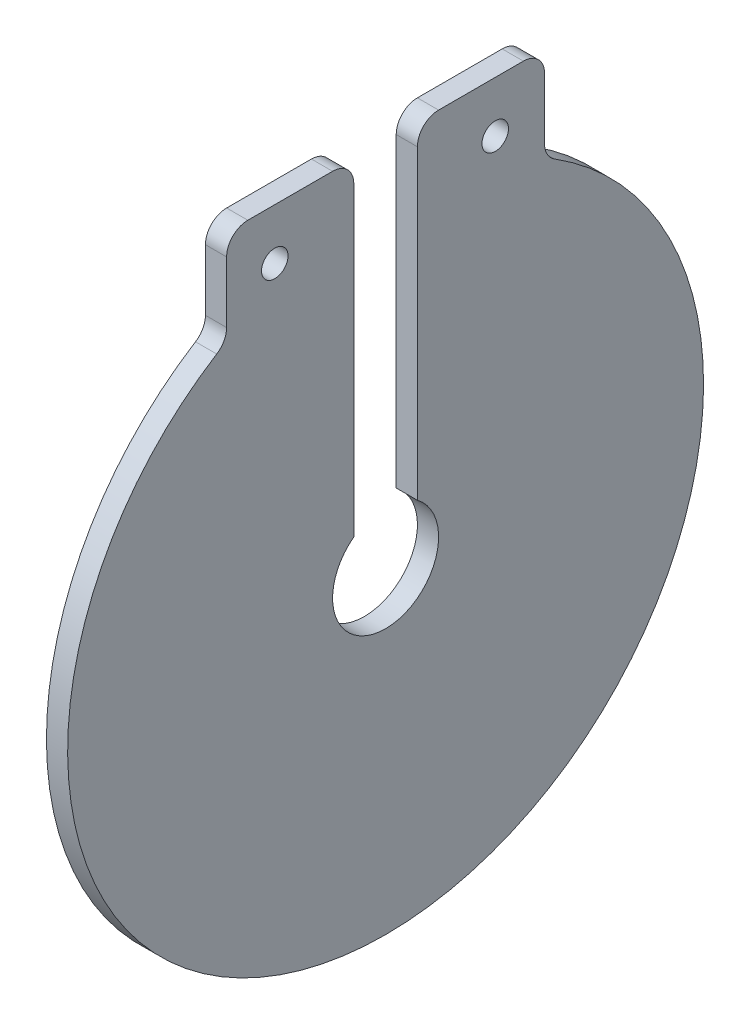
ISO-10303-21;
HEADER;
FILE_DESCRIPTION(('STEP AP214'),'2;1');
FILE_NAME('part.step','',(''),(''),'','','');
FILE_SCHEMA(('AUTOMOTIVE_DESIGN { 1 0 10303 214 1 1 1 1 }'));
ENDSEC;
DATA;
#1=APPLICATION_CONTEXT('core data for automotive mechanical design processes');
#2=APPLICATION_PROTOCOL_DEFINITION('international standard','automotive_design',2000,#1);
#3=PRODUCT_CONTEXT('',#1,'mechanical');
#4=PRODUCT('Part','Part','',(#3));
#5=PRODUCT_RELATED_PRODUCT_CATEGORY('part','',(#4));
#6=PRODUCT_DEFINITION_FORMATION('','',#4);
#7=PRODUCT_DEFINITION_CONTEXT('part definition',#1,'design');
#8=PRODUCT_DEFINITION('design','',#6,#7);
#9=PRODUCT_DEFINITION_SHAPE('','',#8);
#10=(LENGTH_UNIT() NAMED_UNIT(*) SI_UNIT(.MILLI.,.METRE.));
#11=(NAMED_UNIT(*) PLANE_ANGLE_UNIT() SI_UNIT($,.RADIAN.));
#12=(NAMED_UNIT(*) SI_UNIT($,.STERADIAN.) SOLID_ANGLE_UNIT());
#13=UNCERTAINTY_MEASURE_WITH_UNIT(LENGTH_MEASURE(1.E-05),#10,'distance_accuracy_value','');
#14=(GEOMETRIC_REPRESENTATION_CONTEXT(3) GLOBAL_UNCERTAINTY_ASSIGNED_CONTEXT((#13)) GLOBAL_UNIT_ASSIGNED_CONTEXT((#10,
#11,#12)) REPRESENTATION_CONTEXT('',''));
#15=CARTESIAN_POINT('',(0.,0.,0.));
#16=DIRECTION('',(0.,0.,1.));
#17=DIRECTION('',(1.,0.,0.));
#18=AXIS2_PLACEMENT_3D('',#15,#16,#17);
#19=CARTESIAN_POINT('',(0.,34.8807621135332,15.));
#20=DIRECTION('',(0.,1.,0.));
#21=DIRECTION('',(0.,0.,1.));
#22=AXIS2_PLACEMENT_3D('',#19,#20,#21);
#23=PLANE('',#22);
#24=DIRECTION('',(0.,0.,1.));
#25=VECTOR('',#24,1.);
#26=CARTESIAN_POINT('',(2.,34.8807621135332,15.));
#27=LINE('',#26,#25);
#28=CARTESIAN_POINT('',(2.,34.8807621135332,5.));
#29=VERTEX_POINT('',#28);
#30=CARTESIAN_POINT('',(2.,34.8807621135332,13.));
#31=VERTEX_POINT('',#30);
#32=EDGE_CURVE('E233',#29,#31,#27,.T.);
#33=ORIENTED_EDGE('',*,*,#32,.F.);
#34=DIRECTION('',(1.,0.,0.));
#35=VECTOR('',#34,1.);
#36=CARTESIAN_POINT('',(0.,34.8807621135332,5.));
#37=LINE('',#36,#35);
#38=CARTESIAN_POINT('',(0.,34.8807621135332,5.));
#39=VERTEX_POINT('',#38);
#40=EDGE_CURVE('E216',#29,#39,#37,.F.);
#41=ORIENTED_EDGE('',*,*,#40,.T.);
#42=DIRECTION('',(0.,0.,1.));
#43=VECTOR('',#42,1.);
#44=CARTESIAN_POINT('',(0.,34.8807621135332,15.));
#45=LINE('',#44,#43);
#46=CARTESIAN_POINT('',(0.,34.8807621135332,13.));
#47=VERTEX_POINT('',#46);
#48=EDGE_CURVE('E168',#39,#47,#45,.T.);
#49=ORIENTED_EDGE('',*,*,#48,.T.);
#50=DIRECTION('',(1.,0.,0.));
#51=VECTOR('',#50,1.);
#52=CARTESIAN_POINT('',(0.,34.8807621135332,13.));
#53=LINE('',#52,#51);
#54=EDGE_CURVE('E214',#47,#31,#53,.T.);
#55=ORIENTED_EDGE('',*,*,#54,.T.);
#56=EDGE_LOOP('',(#33,#41,#49,#55));
#57=FACE_BOUND('',#56,.T.);
#58=ADVANCED_FACE('F35',(#57),#23,.T.);
#59=CARTESIAN_POINT('',(2.,0.,0.));
#60=DIRECTION('',(-1.,0.,0.));
#61=DIRECTION('',(0.,0.,1.));
#62=AXIS2_PLACEMENT_3D('',#59,#60,#61);
#63=CYLINDRICAL_SURFACE('',#62,30.);
#64=CARTESIAN_POINT('',(2.,0.,0.));
#65=DIRECTION('',(1.,0.,0.));
#66=DIRECTION('',(0.,0.,-1.));
#67=AXIS2_PLACEMENT_3D('',#64,#65,#66);
#68=CIRCLE('',#67,30.);
#69=CARTESIAN_POINT('',(2.,25.4164532094862,15.9375));
#70=VERTEX_POINT('',#69);
#71=CARTESIAN_POINT('',(2.,25.4164532094862,-15.9375));
#72=VERTEX_POINT('',#71);
#73=EDGE_CURVE('E172',#70,#72,#68,.T.);
#74=ORIENTED_EDGE('',*,*,#73,.F.);
#75=DIRECTION('',(-1.,0.,0.));
#76=VECTOR('',#75,1.);
#77=CARTESIAN_POINT('',(2.,25.4164532094862,15.9375));
#78=LINE('',#77,#76);
#79=CARTESIAN_POINT('',(0.,25.4164532094862,15.9375));
#80=VERTEX_POINT('',#79);
#81=EDGE_CURVE('E185',#70,#80,#78,.T.);
#82=ORIENTED_EDGE('',*,*,#81,.T.);
#83=CARTESIAN_POINT('',(0.,0.,0.));
#84=DIRECTION('',(1.,0.,0.));
#85=DIRECTION('',(0.,0.,-1.));
#86=AXIS2_PLACEMENT_3D('',#83,#84,#85);
#87=CIRCLE('',#86,30.);
#88=CARTESIAN_POINT('',(0.,25.4164532094862,-15.9375));
#89=VERTEX_POINT('',#88);
#90=EDGE_CURVE('E165',#80,#89,#87,.T.);
#91=ORIENTED_EDGE('',*,*,#90,.T.);
#92=DIRECTION('',(-1.,0.,0.));
#93=VECTOR('',#92,1.);
#94=CARTESIAN_POINT('',(2.,25.4164532094862,-15.9375));
#95=LINE('',#94,#93);
#96=EDGE_CURVE('E182',#89,#72,#95,.F.);
#97=ORIENTED_EDGE('',*,*,#96,.T.);
#98=EDGE_LOOP('',(#74,#82,#91,#97));
#99=FACE_BOUND('',#98,.T.);
#100=ADVANCED_FACE('F244',(#99),#63,.T.);
#101=CARTESIAN_POINT('',(2.,0.,0.));
#102=DIRECTION('',(1.,0.,0.));
#103=DIRECTION('',(0.,0.,-1.));
#104=AXIS2_PLACEMENT_3D('',#101,#102,#103);
#105=PLANE('',#104);
#106=CARTESIAN_POINT('',(2.,30.0807621135332,10.4556028661762));
#107=DIRECTION('',(1.,0.,0.));
#108=DIRECTION('',(0.,0.,-1.));
#109=AXIS2_PLACEMENT_3D('',#106,#107,#108);
#110=CIRCLE('',#109,1.25);
#111=CARTESIAN_POINT('',(2.,30.0807621135332,9.2056028661762));
#112=VERTEX_POINT('',#111);
#113=EDGE_CURVE('E450',#112,#112,#110,.T.);
#114=ORIENTED_EDGE('',*,*,#113,.F.);
#115=EDGE_LOOP('',(#114));
#116=FACE_BOUND('',#115,.T.);
#117=CARTESIAN_POINT('',(2.,30.0807621135332,-10.3443971338238));
#118=DIRECTION('',(1.,0.,0.));
#119=DIRECTION('',(0.,0.,-1.));
#120=AXIS2_PLACEMENT_3D('',#117,#118,#119);
#121=CIRCLE('',#120,1.25);
#122=CARTESIAN_POINT('',(2.,30.0807621135332,-11.5943971338238));
#123=VERTEX_POINT('',#122);
#124=EDGE_CURVE('E275',#123,#123,#121,.T.);
#125=ORIENTED_EDGE('',*,*,#124,.F.);
#126=EDGE_LOOP('',(#125));
#127=FACE_BOUND('',#126,.T.);
#128=CARTESIAN_POINT('',(2.,34.8807621135332,-13.));
#129=VERTEX_POINT('',#128);
#130=CARTESIAN_POINT('',(2.,34.8807621135332,-5.));
#131=VERTEX_POINT('',#130);
#132=EDGE_CURVE('E257',#129,#131,#27,.T.);
#133=ORIENTED_EDGE('',*,*,#132,.T.);
#134=CARTESIAN_POINT('',(2.,32.8807621135332,-5.));
#135=DIRECTION('',(1.,0.,0.));
#136=DIRECTION('',(0.,0.,-1.));
#137=AXIS2_PLACEMENT_3D('',#134,#135,#136);
#138=CIRCLE('',#137,2.);
#139=CARTESIAN_POINT('',(2.,32.8807621135332,-3.));
#140=VERTEX_POINT('',#139);
#141=EDGE_CURVE('E211',#131,#140,#138,.T.);
#142=ORIENTED_EDGE('',*,*,#141,.T.);
#143=DIRECTION('',(0.,1.,0.));
#144=VECTOR('',#143,1.);
#145=CARTESIAN_POINT('',(2.,38.3726995578938,-3.));
#146=LINE('',#145,#144);
#147=CARTESIAN_POINT('',(2.,4.,-3.));
#148=VERTEX_POINT('',#147);
#149=EDGE_CURVE('E146',#148,#140,#146,.T.);
#150=ORIENTED_EDGE('',*,*,#149,.F.);
#151=CARTESIAN_POINT('',(2.,0.,0.));
#152=DIRECTION('',(1.,0.,0.));
#153=DIRECTION('',(0.,0.,-1.));
#154=AXIS2_PLACEMENT_3D('',#151,#152,#153);
#155=CIRCLE('',#154,5.);
#156=CARTESIAN_POINT('',(2.,4.,3.));
#157=VERTEX_POINT('',#156);
#158=EDGE_CURVE('E153',#157,#148,#155,.T.);
#159=ORIENTED_EDGE('',*,*,#158,.F.);
#160=DIRECTION('',(0.,-1.,0.));
#161=VECTOR('',#160,1.);
#162=CARTESIAN_POINT('',(2.,38.3726995578938,3.));
#163=LINE('',#162,#161);
#164=CARTESIAN_POINT('',(2.,32.8807621135332,3.));
#165=VERTEX_POINT('',#164);
#166=EDGE_CURVE('E137',#165,#157,#163,.T.);
#167=ORIENTED_EDGE('',*,*,#166,.F.);
#168=CARTESIAN_POINT('',(2.,32.8807621135332,5.));
#169=DIRECTION('',(1.,0.,0.));
#170=DIRECTION('',(0.,0.,-1.));
#171=AXIS2_PLACEMENT_3D('',#168,#169,#170);
#172=CIRCLE('',#171,2.);
#173=EDGE_CURVE('E58',#165,#29,#172,.T.);
#174=ORIENTED_EDGE('',*,*,#173,.T.);
#175=ORIENTED_EDGE('',*,*,#32,.T.);
#176=CARTESIAN_POINT('',(2.,32.8807621135332,13.));
#177=DIRECTION('',(1.,0.,0.));
#178=DIRECTION('',(0.,0.,-1.));
#179=AXIS2_PLACEMENT_3D('',#176,#177,#178);
#180=CIRCLE('',#179,2.);
#181=CARTESIAN_POINT('',(2.,32.8807621135332,15.));
#182=VERTEX_POINT('',#181);
#183=EDGE_CURVE('E50',#31,#182,#180,.T.);
#184=ORIENTED_EDGE('',*,*,#183,.T.);
#185=DIRECTION('',(0.,-1.,0.));
#186=VECTOR('',#185,1.);
#187=CARTESIAN_POINT('',(2.,34.8807621135332,15.));
#188=LINE('',#187,#186);
#189=CARTESIAN_POINT('',(2.,27.1108834234519,15.));
#190=VERTEX_POINT('',#189);
#191=EDGE_CURVE('E156',#182,#190,#188,.T.);
#192=ORIENTED_EDGE('',*,*,#191,.T.);
#193=CARTESIAN_POINT('',(2.,27.1108834234519,17.));
#194=DIRECTION('',(1.,0.,0.));
#195=DIRECTION('',(0.,0.,-1.));
#196=AXIS2_PLACEMENT_3D('',#193,#194,#195);
#197=CIRCLE('',#196,2.);
#198=EDGE_CURVE('E218',#190,#70,#197,.F.);
#199=ORIENTED_EDGE('',*,*,#198,.T.);
#200=ORIENTED_EDGE('',*,*,#73,.T.);
#201=CARTESIAN_POINT('',(2.,27.1108834234519,-17.));
#202=DIRECTION('',(1.,0.,0.));
#203=DIRECTION('',(0.,0.,-1.));
#204=AXIS2_PLACEMENT_3D('',#201,#202,#203);
#205=CIRCLE('',#204,2.);
#206=CARTESIAN_POINT('',(2.,27.1108834234519,-15.));
#207=VERTEX_POINT('',#206);
#208=EDGE_CURVE('E43',#72,#207,#205,.F.);
#209=ORIENTED_EDGE('',*,*,#208,.T.);
#210=DIRECTION('',(0.,1.,0.));
#211=VECTOR('',#210,1.);
#212=CARTESIAN_POINT('',(2.,34.8807621135332,-15.));
#213=LINE('',#212,#211);
#214=CARTESIAN_POINT('',(2.,32.8807621135332,-15.));
#215=VERTEX_POINT('',#214);
#216=EDGE_CURVE('E223',#207,#215,#213,.T.);
#217=ORIENTED_EDGE('',*,*,#216,.T.);
#218=CARTESIAN_POINT('',(2.,32.8807621135332,-13.));
#219=DIRECTION('',(1.,0.,0.));
#220=DIRECTION('',(0.,0.,-1.));
#221=AXIS2_PLACEMENT_3D('',#218,#219,#220);
#222=CIRCLE('',#221,2.);
#223=EDGE_CURVE('E208',#215,#129,#222,.T.);
#224=ORIENTED_EDGE('',*,*,#223,.T.);
#225=EDGE_LOOP('',(#133,#142,#150,#159,#167,#174,#175,#184,#192,#199,#200,#209,#217,#224));
#226=FACE_BOUND('',#225,.T.);
#227=ADVANCED_FACE('F161',(#116,#127,#226),#105,.T.);
#228=CARTESIAN_POINT('',(0.,0.,0.));
#229=DIRECTION('',(1.,0.,0.));
#230=DIRECTION('',(0.,0.,-1.));
#231=AXIS2_PLACEMENT_3D('',#228,#229,#230);
#232=PLANE('',#231);
#233=CARTESIAN_POINT('',(0.,30.0807621135332,10.4556028661762));
#234=DIRECTION('',(1.,0.,0.));
#235=DIRECTION('',(0.,0.,-1.));
#236=AXIS2_PLACEMENT_3D('',#233,#234,#235);
#237=CIRCLE('',#236,1.25);
#238=CARTESIAN_POINT('',(0.,30.0807621135332,9.2056028661762));
#239=VERTEX_POINT('',#238);
#240=EDGE_CURVE('E147',#239,#239,#237,.T.);
#241=ORIENTED_EDGE('',*,*,#240,.T.);
#242=EDGE_LOOP('',(#241));
#243=FACE_BOUND('',#242,.T.);
#244=CARTESIAN_POINT('',(0.,30.0807621135332,-10.3443971338238));
#245=DIRECTION('',(1.,0.,0.));
#246=DIRECTION('',(0.,0.,-1.));
#247=AXIS2_PLACEMENT_3D('',#244,#245,#246);
#248=CIRCLE('',#247,1.25);
#249=CARTESIAN_POINT('',(0.,30.0807621135332,-11.5943971338238));
#250=VERTEX_POINT('',#249);
#251=EDGE_CURVE('E451',#250,#250,#248,.T.);
#252=ORIENTED_EDGE('',*,*,#251,.T.);
#253=EDGE_LOOP('',(#252));
#254=FACE_BOUND('',#253,.T.);
#255=DIRECTION('',(0.,1.,0.));
#256=VECTOR('',#255,1.);
#257=CARTESIAN_POINT('',(0.,38.3726995578938,-3.));
#258=LINE('',#257,#256);
#259=CARTESIAN_POINT('',(0.,4.,-3.));
#260=VERTEX_POINT('',#259);
#261=CARTESIAN_POINT('',(0.,32.8807621135332,-3.));
#262=VERTEX_POINT('',#261);
#263=EDGE_CURVE('E270',#260,#262,#258,.T.);
#264=ORIENTED_EDGE('',*,*,#263,.T.);
#265=CARTESIAN_POINT('',(0.,32.8807621135332,-5.));
#266=DIRECTION('',(1.,0.,0.));
#267=DIRECTION('',(0.,0.,-1.));
#268=AXIS2_PLACEMENT_3D('',#265,#266,#267);
#269=CIRCLE('',#268,2.);
#270=CARTESIAN_POINT('',(0.,34.8807621135332,-5.));
#271=VERTEX_POINT('',#270);
#272=EDGE_CURVE('E201',#262,#271,#269,.F.);
#273=ORIENTED_EDGE('',*,*,#272,.T.);
#274=CARTESIAN_POINT('',(0.,34.8807621135332,-13.));
#275=VERTEX_POINT('',#274);
#276=EDGE_CURVE('E163',#275,#271,#45,.T.);
#277=ORIENTED_EDGE('',*,*,#276,.F.);
#278=CARTESIAN_POINT('',(0.,32.8807621135332,-13.));
#279=DIRECTION('',(1.,0.,0.));
#280=DIRECTION('',(0.,0.,-1.));
#281=AXIS2_PLACEMENT_3D('',#278,#279,#280);
#282=CIRCLE('',#281,2.);
#283=CARTESIAN_POINT('',(0.,32.8807621135332,-15.));
#284=VERTEX_POINT('',#283);
#285=EDGE_CURVE('E197',#275,#284,#282,.F.);
#286=ORIENTED_EDGE('',*,*,#285,.T.);
#287=DIRECTION('',(0.,1.,0.));
#288=VECTOR('',#287,1.);
#289=CARTESIAN_POINT('',(0.,34.8807621135332,-15.));
#290=LINE('',#289,#288);
#291=CARTESIAN_POINT('',(0.,27.1108834234519,-15.));
#292=VERTEX_POINT('',#291);
#293=EDGE_CURVE('E242',#292,#284,#290,.T.);
#294=ORIENTED_EDGE('',*,*,#293,.F.);
#295=CARTESIAN_POINT('',(0.,27.1108834234519,-17.));
#296=DIRECTION('',(1.,0.,0.));
#297=DIRECTION('',(0.,0.,-1.));
#298=AXIS2_PLACEMENT_3D('',#295,#296,#297);
#299=CIRCLE('',#298,2.);
#300=EDGE_CURVE('E11',#292,#89,#299,.T.);
#301=ORIENTED_EDGE('',*,*,#300,.T.);
#302=ORIENTED_EDGE('',*,*,#90,.F.);
#303=CARTESIAN_POINT('',(0.,27.1108834234519,17.));
#304=DIRECTION('',(1.,0.,0.));
#305=DIRECTION('',(0.,0.,-1.));
#306=AXIS2_PLACEMENT_3D('',#303,#304,#305);
#307=CIRCLE('',#306,2.);
#308=CARTESIAN_POINT('',(0.,27.1108834234519,15.));
#309=VERTEX_POINT('',#308);
#310=EDGE_CURVE('E220',#80,#309,#307,.T.);
#311=ORIENTED_EDGE('',*,*,#310,.T.);
#312=DIRECTION('',(0.,-1.,0.));
#313=VECTOR('',#312,1.);
#314=CARTESIAN_POINT('',(0.,34.8807621135332,15.));
#315=LINE('',#314,#313);
#316=CARTESIAN_POINT('',(0.,32.8807621135332,15.));
#317=VERTEX_POINT('',#316);
#318=EDGE_CURVE('E251',#317,#309,#315,.T.);
#319=ORIENTED_EDGE('',*,*,#318,.F.);
#320=CARTESIAN_POINT('',(0.,32.8807621135332,13.));
#321=DIRECTION('',(1.,0.,0.));
#322=DIRECTION('',(0.,0.,-1.));
#323=AXIS2_PLACEMENT_3D('',#320,#321,#322);
#324=CIRCLE('',#323,2.);
#325=EDGE_CURVE('E195',#317,#47,#324,.F.);
#326=ORIENTED_EDGE('',*,*,#325,.T.);
#327=ORIENTED_EDGE('',*,*,#48,.F.);
#328=CARTESIAN_POINT('',(0.,32.8807621135332,5.));
#329=DIRECTION('',(1.,0.,0.));
#330=DIRECTION('',(0.,0.,-1.));
#331=AXIS2_PLACEMENT_3D('',#328,#329,#330);
#332=CIRCLE('',#331,2.);
#333=CARTESIAN_POINT('',(0.,32.8807621135332,3.));
#334=VERTEX_POINT('',#333);
#335=EDGE_CURVE('E199',#39,#334,#332,.F.);
#336=ORIENTED_EDGE('',*,*,#335,.T.);
#337=DIRECTION('',(0.,-1.,0.));
#338=VECTOR('',#337,1.);
#339=CARTESIAN_POINT('',(0.,38.3726995578938,3.));
#340=LINE('',#339,#338);
#341=CARTESIAN_POINT('',(0.,4.,3.));
#342=VERTEX_POINT('',#341);
#343=EDGE_CURVE('E269',#334,#342,#340,.T.);
#344=ORIENTED_EDGE('',*,*,#343,.T.);
#345=CARTESIAN_POINT('',(0.,0.,0.));
#346=DIRECTION('',(1.,0.,0.));
#347=DIRECTION('',(0.,0.,-1.));
#348=AXIS2_PLACEMENT_3D('',#345,#346,#347);
#349=CIRCLE('',#348,5.);
#350=EDGE_CURVE('E155',#342,#260,#349,.T.);
#351=ORIENTED_EDGE('',*,*,#350,.T.);
#352=EDGE_LOOP('',(#264,#273,#277,#286,#294,#301,#302,#311,#319,#326,#327,#336,#344,#351));
#353=FACE_BOUND('',#352,.T.);
#354=ADVANCED_FACE('F240',(#243,#254,#353),#232,.F.);
#355=CARTESIAN_POINT('',(0.,0.,0.));
#356=DIRECTION('',(1.,0.,0.));
#357=DIRECTION('',(0.,0.,-1.));
#358=AXIS2_PLACEMENT_3D('',#355,#356,#357);
#359=CYLINDRICAL_SURFACE('',#358,5.);
#360=ORIENTED_EDGE('',*,*,#350,.F.);
#361=DIRECTION('',(1.,0.,0.));
#362=VECTOR('',#361,1.);
#363=CARTESIAN_POINT('',(0.,4.,3.));
#364=LINE('',#363,#362);
#365=EDGE_CURVE('E141',#342,#157,#364,.T.);
#366=ORIENTED_EDGE('',*,*,#365,.T.);
#367=ORIENTED_EDGE('',*,*,#158,.T.);
#368=DIRECTION('',(1.,0.,0.));
#369=VECTOR('',#368,1.);
#370=CARTESIAN_POINT('',(0.,4.,-3.));
#371=LINE('',#370,#369);
#372=EDGE_CURVE('E157',#148,#260,#371,.F.);
#373=ORIENTED_EDGE('',*,*,#372,.T.);
#374=EDGE_LOOP('',(#360,#366,#367,#373));
#375=FACE_BOUND('',#374,.T.);
#376=ADVANCED_FACE('F151',(#375),#359,.F.);
#377=CARTESIAN_POINT('',(0.,34.8807621135332,15.));
#378=DIRECTION('',(0.,0.,1.));
#379=DIRECTION('',(0.,-1.,0.));
#380=AXIS2_PLACEMENT_3D('',#377,#378,#379);
#381=PLANE('',#380);
#382=ORIENTED_EDGE('',*,*,#318,.T.);
#383=DIRECTION('',(-1.,0.,0.));
#384=VECTOR('',#383,1.);
#385=CARTESIAN_POINT('',(0.,27.1108834234519,15.));
#386=LINE('',#385,#384);
#387=EDGE_CURVE('E179',#309,#190,#386,.F.);
#388=ORIENTED_EDGE('',*,*,#387,.T.);
#389=ORIENTED_EDGE('',*,*,#191,.F.);
#390=DIRECTION('',(1.,0.,0.));
#391=VECTOR('',#390,1.);
#392=CARTESIAN_POINT('',(0.,32.8807621135332,15.));
#393=LINE('',#392,#391);
#394=EDGE_CURVE('E175',#182,#317,#393,.F.);
#395=ORIENTED_EDGE('',*,*,#394,.T.);
#396=EDGE_LOOP('',(#382,#388,#389,#395));
#397=FACE_BOUND('',#396,.T.);
#398=ADVANCED_FACE('F254',(#397),#381,.T.);
#399=ORIENTED_EDGE('',*,*,#276,.T.);
#400=DIRECTION('',(-1.,0.,0.));
#401=VECTOR('',#400,1.);
#402=CARTESIAN_POINT('',(2.,34.8807621135332,-5.));
#403=LINE('',#402,#401);
#404=EDGE_CURVE('E205',#271,#131,#403,.F.);
#405=ORIENTED_EDGE('',*,*,#404,.T.);
#406=ORIENTED_EDGE('',*,*,#132,.F.);
#407=DIRECTION('',(1.,0.,0.));
#408=VECTOR('',#407,1.);
#409=CARTESIAN_POINT('',(0.,34.8807621135332,-13.));
#410=LINE('',#409,#408);
#411=EDGE_CURVE('E203',#129,#275,#410,.F.);
#412=ORIENTED_EDGE('',*,*,#411,.T.);
#413=EDGE_LOOP('',(#399,#405,#406,#412));
#414=FACE_BOUND('',#413,.T.);
#415=ADVANCED_FACE('F287',(#414),#23,.T.);
#416=CARTESIAN_POINT('',(0.,34.8807621135332,-15.));
#417=DIRECTION('',(0.,0.,-1.));
#418=DIRECTION('',(0.,1.,0.));
#419=AXIS2_PLACEMENT_3D('',#416,#417,#418);
#420=PLANE('',#419);
#421=ORIENTED_EDGE('',*,*,#216,.F.);
#422=DIRECTION('',(-1.,0.,0.));
#423=VECTOR('',#422,1.);
#424=CARTESIAN_POINT('',(0.,27.1108834234519,-15.));
#425=LINE('',#424,#423);
#426=EDGE_CURVE('E190',#207,#292,#425,.T.);
#427=ORIENTED_EDGE('',*,*,#426,.T.);
#428=ORIENTED_EDGE('',*,*,#293,.T.);
#429=DIRECTION('',(1.,0.,0.));
#430=VECTOR('',#429,1.);
#431=CARTESIAN_POINT('',(0.,32.8807621135332,-15.));
#432=LINE('',#431,#430);
#433=EDGE_CURVE('E187',#284,#215,#432,.T.);
#434=ORIENTED_EDGE('',*,*,#433,.T.);
#435=EDGE_LOOP('',(#421,#427,#428,#434));
#436=FACE_BOUND('',#435,.T.);
#437=ADVANCED_FACE('F229',(#436),#420,.T.);
#438=CARTESIAN_POINT('',(0.,38.3726995578938,-3.));
#439=DIRECTION('',(0.,0.,-1.));
#440=DIRECTION('',(0.,1.,0.));
#441=AXIS2_PLACEMENT_3D('',#438,#439,#440);
#442=PLANE('',#441);
#443=ORIENTED_EDGE('',*,*,#149,.T.);
#444=DIRECTION('',(-1.,0.,0.));
#445=VECTOR('',#444,1.);
#446=CARTESIAN_POINT('',(0.,32.8807621135332,-3.));
#447=LINE('',#446,#445);
#448=EDGE_CURVE('E192',#140,#262,#447,.T.);
#449=ORIENTED_EDGE('',*,*,#448,.T.);
#450=ORIENTED_EDGE('',*,*,#263,.F.);
#451=ORIENTED_EDGE('',*,*,#372,.F.);
#452=EDGE_LOOP('',(#443,#449,#450,#451));
#453=FACE_BOUND('',#452,.T.);
#454=ADVANCED_FACE('F279',(#453),#442,.F.);
#455=CARTESIAN_POINT('',(0.,38.3726995578938,3.));
#456=DIRECTION('',(0.,0.,1.));
#457=DIRECTION('',(0.,-1.,0.));
#458=AXIS2_PLACEMENT_3D('',#455,#456,#457);
#459=PLANE('',#458);
#460=ORIENTED_EDGE('',*,*,#343,.F.);
#461=DIRECTION('',(1.,0.,0.));
#462=VECTOR('',#461,1.);
#463=CARTESIAN_POINT('',(2.,32.8807621135332,3.));
#464=LINE('',#463,#462);
#465=EDGE_CURVE('E144',#334,#165,#464,.T.);
#466=ORIENTED_EDGE('',*,*,#465,.T.);
#467=ORIENTED_EDGE('',*,*,#166,.T.);
#468=ORIENTED_EDGE('',*,*,#365,.F.);
#469=EDGE_LOOP('',(#460,#466,#467,#468));
#470=FACE_BOUND('',#469,.T.);
#471=ADVANCED_FACE('F140',(#470),#459,.F.);
#472=CARTESIAN_POINT('',(2.,27.1108834234519,17.));
#473=DIRECTION('',(-1.,0.,0.));
#474=DIRECTION('',(0.,0.,1.));
#475=AXIS2_PLACEMENT_3D('',#472,#473,#474);
#476=CYLINDRICAL_SURFACE('',#475,2.);
#477=ORIENTED_EDGE('',*,*,#310,.F.);
#478=ORIENTED_EDGE('',*,*,#81,.F.);
#479=ORIENTED_EDGE('',*,*,#198,.F.);
#480=ORIENTED_EDGE('',*,*,#387,.F.);
#481=EDGE_LOOP('',(#477,#478,#479,#480));
#482=FACE_BOUND('',#481,.T.);
#483=ADVANCED_FACE('F247',(#482),#476,.F.);
#484=CARTESIAN_POINT('',(2.,27.1108834234519,-17.));
#485=DIRECTION('',(-1.,0.,0.));
#486=DIRECTION('',(0.,0.,1.));
#487=AXIS2_PLACEMENT_3D('',#484,#485,#486);
#488=CYLINDRICAL_SURFACE('',#487,2.);
#489=ORIENTED_EDGE('',*,*,#300,.F.);
#490=ORIENTED_EDGE('',*,*,#426,.F.);
#491=ORIENTED_EDGE('',*,*,#208,.F.);
#492=ORIENTED_EDGE('',*,*,#96,.F.);
#493=EDGE_LOOP('',(#489,#490,#491,#492));
#494=FACE_BOUND('',#493,.T.);
#495=ADVANCED_FACE('F236',(#494),#488,.F.);
#496=CARTESIAN_POINT('',(0.,32.8807621135332,-5.));
#497=DIRECTION('',(1.,0.,0.));
#498=DIRECTION('',(0.,0.,-1.));
#499=AXIS2_PLACEMENT_3D('',#496,#497,#498);
#500=CYLINDRICAL_SURFACE('',#499,2.);
#501=ORIENTED_EDGE('',*,*,#141,.F.);
#502=ORIENTED_EDGE('',*,*,#404,.F.);
#503=ORIENTED_EDGE('',*,*,#272,.F.);
#504=ORIENTED_EDGE('',*,*,#448,.F.);
#505=EDGE_LOOP('',(#501,#502,#503,#504));
#506=FACE_BOUND('',#505,.T.);
#507=ADVANCED_FACE('F283',(#506),#500,.T.);
#508=CARTESIAN_POINT('',(0.,32.8807621135332,5.));
#509=DIRECTION('',(-1.,0.,0.));
#510=DIRECTION('',(0.,0.,1.));
#511=AXIS2_PLACEMENT_3D('',#508,#509,#510);
#512=CYLINDRICAL_SURFACE('',#511,2.);
#513=ORIENTED_EDGE('',*,*,#335,.F.);
#514=ORIENTED_EDGE('',*,*,#40,.F.);
#515=ORIENTED_EDGE('',*,*,#173,.F.);
#516=ORIENTED_EDGE('',*,*,#465,.F.);
#517=EDGE_LOOP('',(#513,#514,#515,#516));
#518=FACE_BOUND('',#517,.T.);
#519=ADVANCED_FACE('F268',(#518),#512,.T.);
#520=CARTESIAN_POINT('',(0.,32.8807621135332,-13.));
#521=DIRECTION('',(1.,0.,0.));
#522=DIRECTION('',(0.,0.,-1.));
#523=AXIS2_PLACEMENT_3D('',#520,#521,#522);
#524=CYLINDRICAL_SURFACE('',#523,2.);
#525=ORIENTED_EDGE('',*,*,#285,.F.);
#526=ORIENTED_EDGE('',*,*,#411,.F.);
#527=ORIENTED_EDGE('',*,*,#223,.F.);
#528=ORIENTED_EDGE('',*,*,#433,.F.);
#529=EDGE_LOOP('',(#525,#526,#527,#528));
#530=FACE_BOUND('',#529,.T.);
#531=ADVANCED_FACE('F291',(#530),#524,.T.);
#532=CARTESIAN_POINT('',(0.,32.8807621135332,13.));
#533=DIRECTION('',(1.,0.,0.));
#534=DIRECTION('',(0.,0.,-1.));
#535=AXIS2_PLACEMENT_3D('',#532,#533,#534);
#536=CYLINDRICAL_SURFACE('',#535,2.);
#537=ORIENTED_EDGE('',*,*,#325,.F.);
#538=ORIENTED_EDGE('',*,*,#394,.F.);
#539=ORIENTED_EDGE('',*,*,#183,.F.);
#540=ORIENTED_EDGE('',*,*,#54,.F.);
#541=EDGE_LOOP('',(#537,#538,#539,#540));
#542=FACE_BOUND('',#541,.T.);
#543=ADVANCED_FACE('F37',(#542),#536,.T.);
#544=CARTESIAN_POINT('',(0.,30.0807621135332,-10.3443971338238));
#545=DIRECTION('',(1.,0.,0.));
#546=DIRECTION('',(0.,0.,-1.));
#547=AXIS2_PLACEMENT_3D('',#544,#545,#546);
#548=CYLINDRICAL_SURFACE('',#547,1.25);
#549=ORIENTED_EDGE('',*,*,#251,.F.);
#550=EDGE_LOOP('',(#549));
#551=FACE_BOUND('',#550,.T.);
#552=ORIENTED_EDGE('',*,*,#124,.T.);
#553=EDGE_LOOP('',(#552));
#554=FACE_BOUND('',#553,.T.);
#555=ADVANCED_FACE('F297',(#551,#554),#548,.F.);
#556=CARTESIAN_POINT('',(0.,30.0807621135332,10.4556028661762));
#557=DIRECTION('',(1.,0.,0.));
#558=DIRECTION('',(0.,0.,-1.));
#559=AXIS2_PLACEMENT_3D('',#556,#557,#558);
#560=CYLINDRICAL_SURFACE('',#559,1.25);
#561=ORIENTED_EDGE('',*,*,#240,.F.);
#562=EDGE_LOOP('',(#561));
#563=FACE_BOUND('',#562,.T.);
#564=ORIENTED_EDGE('',*,*,#113,.T.);
#565=EDGE_LOOP('',(#564));
#566=FACE_BOUND('',#565,.T.);
#567=ADVANCED_FACE('F372',(#563,#566),#560,.F.);
#568=CLOSED_SHELL('',(#58,#100,#227,#354,#376,#398,#415,#437,#454,#471,#483,#495,#507,#519,#531,
#543,#555,#567));
#569=MANIFOLD_SOLID_BREP('B2',#568);
#570=ADVANCED_BREP_SHAPE_REPRESENTATION('',(#18,#569),#14);
#571=SHAPE_DEFINITION_REPRESENTATION(#9,#570);
ENDSEC;
END-ISO-10303-21;
